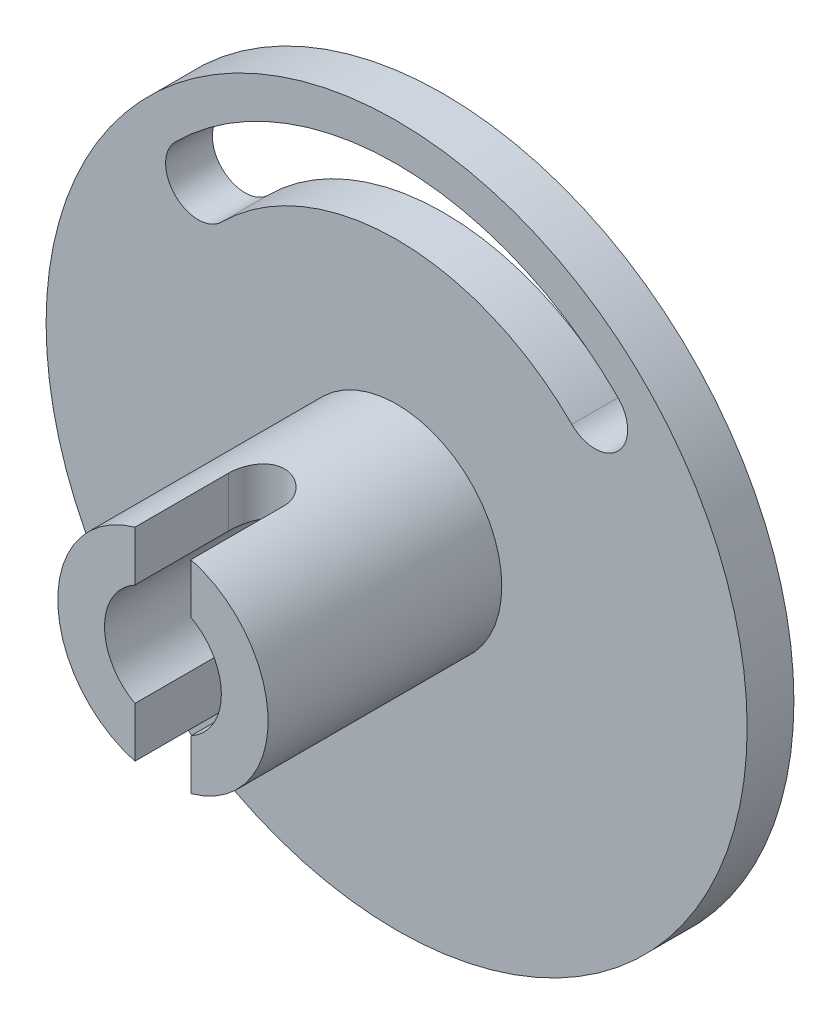
ISO-10303-21;
HEADER;
FILE_DESCRIPTION(('STEP AP214'),'2;1');
FILE_NAME('part.step','',(''),(''),'','','');
FILE_SCHEMA(('AUTOMOTIVE_DESIGN { 1 0 10303 214 1 1 1 1 }'));
ENDSEC;
DATA;
#1=APPLICATION_CONTEXT('core data for automotive mechanical design processes');
#2=APPLICATION_PROTOCOL_DEFINITION('international standard','automotive_design',2000,#1);
#3=PRODUCT_CONTEXT('',#1,'mechanical');
#4=PRODUCT('Part','Part','',(#3));
#5=PRODUCT_RELATED_PRODUCT_CATEGORY('part','',(#4));
#6=PRODUCT_DEFINITION_FORMATION('','',#4);
#7=PRODUCT_DEFINITION_CONTEXT('part definition',#1,'design');
#8=PRODUCT_DEFINITION('design','',#6,#7);
#9=PRODUCT_DEFINITION_SHAPE('','',#8);
#10=(LENGTH_UNIT() NAMED_UNIT(*) SI_UNIT(.MILLI.,.METRE.));
#11=(NAMED_UNIT(*) PLANE_ANGLE_UNIT() SI_UNIT($,.RADIAN.));
#12=(NAMED_UNIT(*) SI_UNIT($,.STERADIAN.) SOLID_ANGLE_UNIT());
#13=UNCERTAINTY_MEASURE_WITH_UNIT(LENGTH_MEASURE(1.E-05),#10,'distance_accuracy_value','');
#14=(GEOMETRIC_REPRESENTATION_CONTEXT(3) GLOBAL_UNCERTAINTY_ASSIGNED_CONTEXT((#13)) GLOBAL_UNIT_ASSIGNED_CONTEXT((#10,
#11,#12)) REPRESENTATION_CONTEXT('',''));
#15=CARTESIAN_POINT('',(0.,0.,0.));
#16=DIRECTION('',(0.,0.,1.));
#17=DIRECTION('',(1.,0.,0.));
#18=AXIS2_PLACEMENT_3D('',#15,#16,#17);
#19=CARTESIAN_POINT('',(0.,-30.,40.));
#20=DIRECTION('',(0.,1.,0.));
#21=DIRECTION('',(0.,0.,1.));
#22=AXIS2_PLACEMENT_3D('',#19,#20,#21);
#23=CYLINDRICAL_SURFACE('',#22,6.);
#24=DIRECTION('',(0.,1.,0.));
#25=VECTOR('',#24,1.);
#26=CARTESIAN_POINT('',(-6.,-30.,40.));
#27=LINE('',#26,#25);
#28=CARTESIAN_POINT('',(-6.,10.9658560997307,40.));
#29=VERTEX_POINT('',#28);
#30=CARTESIAN_POINT('',(-6.,21.6852484422014,40.));
#31=VERTEX_POINT('',#30);
#32=EDGE_CURVE('E228',#29,#31,#27,.T.);
#33=ORIENTED_EDGE('',*,*,#32,.F.);
#34=CARTESIAN_POINT('',(-6.,10.9658560997307,40.));
#35=CARTESIAN_POINT('',(-6.00002865948876,10.9658119468546,39.8419259882187));
#36=CARTESIAN_POINT('',(-5.99375451599358,10.9692726606811,39.6838722207561));
#37=CARTESIAN_POINT('',(-5.96881948529983,10.9828758236465,39.3691201890522));
#38=CARTESIAN_POINT('',(-5.95016553132486,10.9930145327984,39.2124212158005));
#39=CARTESIAN_POINT('',(-5.90082132025953,11.0195753009746,38.9023437710375));
#40=CARTESIAN_POINT('',(-5.8701958306938,11.0359635377871,38.7489520415639));
#41=CARTESIAN_POINT('',(-5.79727964022485,11.0744416185969,38.4456930546913));
#42=CARTESIAN_POINT('',(-5.75498774819269,11.0965320447675,38.295826158871));
#43=CARTESIAN_POINT('',(-5.65928588338994,11.1456431526631,38.0008837379133));
#44=CARTESIAN_POINT('',(-5.60589997779659,11.1726531465412,37.8557986159036));
#45=CARTESIAN_POINT('',(-5.48844655650736,11.2308170083332,37.570857421723));
#46=CARTESIAN_POINT('',(-5.42437498297044,11.2619724495526,37.4310033608222));
#47=CARTESIAN_POINT('',(-5.2167306896531,11.3604221644973,37.0200913822479));
#48=CARTESIAN_POINT('',(-5.05777011280692,11.4326773866541,36.7578109858411));
#49=CARTESIAN_POINT('',(-4.68966781990349,11.5887834599461,36.2430458659001));
#50=CARTESIAN_POINT('',(-4.47765588198518,11.6730975702765,35.9927726188625));
#51=CARTESIAN_POINT('',(-4.01522374861989,11.8401113873892,35.5295510788278));
#52=CARTESIAN_POINT('',(-3.76479376078549,11.9228106764937,35.3166123317687));
#53=CARTESIAN_POINT('',(-3.35614083480019,12.0419362088833,35.0233721116099));
#54=CARTESIAN_POINT('',(-3.20973726709479,12.0818783561493,34.9276924078461));
#55=CARTESIAN_POINT('',(-2.90840720483191,12.1579299817597,34.7491148567846));
#56=CARTESIAN_POINT('',(-2.7534840912193,12.1940409640564,34.6662119880169));
#57=CARTESIAN_POINT('',(-2.43612856249135,12.2613862568142,34.5139950145194));
#58=CARTESIAN_POINT('',(-2.27369783359533,12.2926216555049,34.4446778765709));
#59=CARTESIAN_POINT('',(-1.94246125709468,12.3492939056924,34.32037652835));
#60=CARTESIAN_POINT('',(-1.77365602769167,12.3747313178053,34.2653909322651));
#61=CARTESIAN_POINT('',(-1.44241298474883,12.4175463274212,34.1735953170178));
#62=CARTESIAN_POINT('',(-1.28029686698486,12.4353470131061,34.1358207085291));
#63=CARTESIAN_POINT('',(-0.952942552143277,12.4647060329977,34.0738170536926));
#64=CARTESIAN_POINT('',(-0.787704633331249,12.4762649208831,34.0495868058857));
#65=CARTESIAN_POINT('',(-0.455526503518663,12.4928034709928,34.0149879253022));
#66=CARTESIAN_POINT('',(-0.288587045513745,12.4977859261428,34.0046134081542));
#67=CARTESIAN_POINT('',(0.0456365201176001,12.5010335468412,33.9978462171405));
#68=CARTESIAN_POINT('',(0.212920608276957,12.499299081943,34.0014527740601));
#69=CARTESIAN_POINT('',(0.53294781369326,12.4895756225528,34.0217421262803));
#70=CARTESIAN_POINT('',(0.685776369621216,12.4821019192957,34.0373477386514));
#71=CARTESIAN_POINT('',(0.98948020231024,12.4617052363773,34.0801644991114));
#72=CARTESIAN_POINT('',(1.14035484215988,12.4487805237681,34.1073793379583));
#73=CARTESIAN_POINT('',(1.43902115494811,12.4177998497615,34.1731147223819));
#74=CARTESIAN_POINT('',(1.58681389499011,12.3997456971891,34.2116312827215));
#75=CARTESIAN_POINT('',(1.87849130687657,12.3589226810899,34.299606387742));
#76=CARTESIAN_POINT('',(2.02237446054318,12.3361520148184,34.3490691167609));
#77=CARTESIAN_POINT('',(2.3073494901745,12.2860634503394,34.4592600998468));
#78=CARTESIAN_POINT('',(2.44837311723189,12.258685800032,34.5201377765698));
#79=CARTESIAN_POINT('',(2.72474698441202,12.2002354444059,34.6521741768075));
#80=CARTESIAN_POINT('',(2.86009514569277,12.1691614008679,34.7233366257737));
#81=CARTESIAN_POINT('',(3.25656885919491,12.0713983664922,34.9514744426594));
#82=CARTESIAN_POINT('',(3.50829157931999,12.0001377326273,35.1231657443195));
#83=CARTESIAN_POINT('',(4.00278534575974,11.8448666981681,35.5181762319337));
#84=CARTESIAN_POINT('',(4.24277625794339,11.7602860392511,35.7447262232682));
#85=CARTESIAN_POINT('',(4.68293947649583,11.5920500033531,36.2345756503236));
#86=CARTESIAN_POINT('',(4.88308054052515,11.5083954005457,36.4979036470218));
#87=CARTESIAN_POINT('',(5.15450298754663,11.3882251329188,36.9240180679913));
#88=CARTESIAN_POINT('',(5.2420440990787,11.3480829170677,37.0756594241728));
#89=CARTESIAN_POINT('',(5.40388301696457,11.2719134545959,37.3868108132584));
#90=CARTESIAN_POINT('',(5.47818664143396,11.2358844026786,37.5463173497191));
#91=CARTESIAN_POINT('',(5.61270091926787,11.1692983255289,37.8719566427071));
#92=CARTESIAN_POINT('',(5.67293484246026,11.138732284994,38.0380779186946));
#93=CARTESIAN_POINT('',(5.77872158663383,11.084219027667,38.3758985142118));
#94=CARTESIAN_POINT('',(5.82428083282873,11.0602689147891,38.5475953561667));
#95=CARTESIAN_POINT('',(5.90773031960751,11.0159628213759,38.9302687735291));
#96=CARTESIAN_POINT('',(5.94223918656033,10.9972964956355,39.1422046931604));
#97=CARTESIAN_POINT('',(5.97684365134824,10.9785011938486,39.462484771451));
#98=CARTESIAN_POINT('',(5.98551871669007,10.9737700439536,39.5697158332003));
#99=CARTESIAN_POINT('',(5.99709865291582,10.9674441650941,39.7846209630894));
#100=CARTESIAN_POINT('',(6.00000137642852,10.9658506033473,39.8922951811672));
#101=CARTESIAN_POINT('',(6.,10.9658560997307,40.));
#102=B_SPLINE_CURVE_WITH_KNOTS('',3,(#34,#35,#36,#37,#38,#39,#40,#41,#42,#43,#44,#45,#46,#47,
#48,#49,#50,#51,#52,#53,#54,#55,#56,#57,#58,#59,#60,#61,#62,#63,#64,#65,#66,#67,#68,#69,#70,#71,
#72,#73,#74,#75,#76,#77,#78,#79,#80,#81,#82,#83,#84,#85,#86,#87,#88,#89,#90,#91,#92,#93,#94,#95,
#96,#97,#98,#99,#100,#101),.UNSPECIFIED.,.F.,.F.,(4,2,2,2,2,2,2,2,2,2,2,2,2,2,2,2,2,2,2,2,2,2,2,
2,2,2,2,2,2,2,2,2,2,4),(0.,0.474027754495683,0.947790256942229,1.41902434917404,
1.89030657179063,2.36057688020513,2.8310261802844,3.77232778554665,4.7842552393999,
5.7964410535986,6.33405613251356,6.87145937959838,7.40874250630249,7.94597366022063,
8.44752474430664,8.94903133099696,9.45032486574069,9.95159082057141,10.4124617634167,
10.8734793337998,11.3343345341506,11.7953662085948,12.2629176975072,12.7306389739876,
13.6655389236668,14.6834628863175,15.7021817873902,16.2405100712385,16.7786011631659,
17.3157959052474,17.8527551192991,18.4976279333002,18.8205113672206,19.143514894684),.UNSPECIFIED.);
#103=CARTESIAN_POINT('',(6.,10.9658560997307,40.));
#104=VERTEX_POINT('',#103);
#105=EDGE_CURVE('E48',#29,#104,#102,.T.);
#106=ORIENTED_EDGE('',*,*,#105,.T.);
#107=DIRECTION('',(0.,1.,0.));
#108=VECTOR('',#107,1.);
#109=CARTESIAN_POINT('',(6.,-30.,40.));
#110=LINE('',#109,#108);
#111=CARTESIAN_POINT('',(6.,21.6852484422014,40.));
#112=VERTEX_POINT('',#111);
#113=EDGE_CURVE('E138',#104,#112,#110,.T.);
#114=ORIENTED_EDGE('',*,*,#113,.T.);
#115=CARTESIAN_POINT('',(-6.,21.6852484422014,40.));
#116=CARTESIAN_POINT('',(-6.00002143757072,21.6852278454503,39.8344657481758));
#117=CARTESIAN_POINT('',(-5.99315056555718,21.6871431547269,39.6689387735071));
#118=CARTESIAN_POINT('',(-5.96578222072956,21.6946955183995,39.3391304628435));
#119=CARTESIAN_POINT('',(-5.94528727869301,21.7003318815793,39.1748489012347));
#120=CARTESIAN_POINT('',(-5.89088722832448,21.7151604368289,38.8490506251658));
#121=CARTESIAN_POINT('',(-5.85701103724506,21.7243449602904,38.6875287271007));
#122=CARTESIAN_POINT('',(-5.77614189060431,21.7459869107053,38.3680268504027));
#123=CARTESIAN_POINT('',(-5.7291487046661,21.7584443951422,38.210046934031));
#124=CARTESIAN_POINT('',(-5.62244844449365,21.7862595557273,37.898778157833));
#125=CARTESIAN_POINT('',(-5.5627464521228,21.8016160723642,37.7454874508741));
#126=CARTESIAN_POINT('',(-5.43105556556831,21.8347943803513,37.4444899712217));
#127=CARTESIAN_POINT('',(-5.35906211000339,21.8526170864411,37.2967852964599));
#128=CARTESIAN_POINT('',(-5.20333662362518,21.8902192755553,37.0079769568008));
#129=CARTESIAN_POINT('',(-5.11960543026253,21.9099986189501,36.866872821933));
#130=CARTESIAN_POINT('',(-4.94094856899288,21.9509778091758,36.5920834362246));
#131=CARTESIAN_POINT('',(-4.84601867880679,21.9721781904758,36.4584010117305));
#132=CARTESIAN_POINT('',(-4.64340207624226,22.0158985883613,36.1964708900077));
#133=CARTESIAN_POINT('',(-4.53547997934762,22.0384374065116,36.0684083582649));
#134=CARTESIAN_POINT('',(-4.30929768656988,22.0837781774897,35.821726781896));
#135=CARTESIAN_POINT('',(-4.19103366661629,22.1065802249221,35.7031112616758));
#136=CARTESIAN_POINT('',(-3.94499167074771,22.151809846686,35.4761692828282));
#137=CARTESIAN_POINT('',(-3.81721561547063,22.1742374955011,35.3678407570841));
#138=CARTESIAN_POINT('',(-3.55289974711594,22.218119949707,35.1621328677686));
#139=CARTESIAN_POINT('',(-3.41635672280239,22.2395743936573,35.0647575525824));
#140=CARTESIAN_POINT('',(-3.13322318752662,22.2812410504669,34.8802431997376));
#141=CARTESIAN_POINT('',(-2.9865086519568,22.3014284934186,34.793288724999));
#142=CARTESIAN_POINT('',(-2.68592829952507,22.3396227826506,34.6320500967334));
#143=CARTESIAN_POINT('',(-2.5320597988738,22.3576288012916,34.5577707478492));
#144=CARTESIAN_POINT('',(-2.21838371765237,22.3909274486183,34.4225520151942));
#145=CARTESIAN_POINT('',(-2.05857945457784,22.4062215661867,34.3616053072395));
#146=CARTESIAN_POINT('',(-1.73404500550142,22.4336713831201,34.2534924223287));
#147=CARTESIAN_POINT('',(-1.5693130878467,22.4458259643973,34.2063311540168));
#148=CARTESIAN_POINT('',(-1.24005619019484,22.4663935206214,34.1271586625682));
#149=CARTESIAN_POINT('',(-1.07561422327453,22.4748863939196,34.0948228306116));
#150=CARTESIAN_POINT('',(-0.744456504527512,22.4882912356254,34.0440076424904));
#151=CARTESIAN_POINT('',(-0.577740761466932,22.4932032178345,34.0255282329203));
#152=CARTESIAN_POINT('',(-0.24330107712226,22.4993060509493,34.002592620523));
#153=CARTESIAN_POINT('',(-0.0755772690246393,22.500497383054,33.9981346042814));
#154=CARTESIAN_POINT('',(0.25963824141814,22.4991261882436,34.0032770804847));
#155=CARTESIAN_POINT('',(0.42712994670412,22.4965637093341,34.0128773931451));
#156=CARTESIAN_POINT('',(0.756407114123261,22.4878697933301,34.0456294902287));
#157=CARTESIAN_POINT('',(0.918229819656834,22.4818301770551,34.0684327101634));
#158=CARTESIAN_POINT('',(1.23932087464832,22.4664175641162,34.1271200346061));
#159=CARTESIAN_POINT('',(1.39858926236569,22.4570446174291,34.1630039429955));
#160=CARTESIAN_POINT('',(1.7135065587437,22.4352137308963,34.2475672702987));
#161=CARTESIAN_POINT('',(1.86915475031831,22.4227551854552,34.2962492011335));
#162=CARTESIAN_POINT('',(2.17570551000697,22.3950884203608,34.4060029933642));
#163=CARTESIAN_POINT('',(2.32660963476586,22.3798811139353,34.4670707406092));
#164=CARTESIAN_POINT('',(2.62427084456351,22.3469428831416,34.6018366665011));
#165=CARTESIAN_POINT('',(2.77096937273041,22.3291876297757,34.6756581979149));
#166=CARTESIAN_POINT('',(3.05758902729823,22.2917481176719,34.8349229916975));
#167=CARTESIAN_POINT('',(3.19751240266912,22.2720645056915,34.9203623612322));
#168=CARTESIAN_POINT('',(3.46982739642779,22.231267729594,35.1023343954026));
#169=CARTESIAN_POINT('',(3.60221530664343,22.2101538726621,35.1988724522902));
#170=CARTESIAN_POINT('',(3.85852742029929,22.1670623307285,35.4023341163944));
#171=CARTESIAN_POINT('',(3.98245442062933,22.1450849350055,35.5092542630568));
#172=CARTESIAN_POINT('',(4.22483789945815,22.100144944171,35.7362966744966));
#173=CARTESIAN_POINT('',(4.34300571313122,22.0771729277197,35.8567254470798));
#174=CARTESIAN_POINT('',(4.56877156178869,22.0315589266685,36.10709226248));
#175=CARTESIAN_POINT('',(4.67637327905837,22.0089168294511,36.2370269647348));
#176=CARTESIAN_POINT('',(4.88039540260501,21.9645771459455,36.5056889443041));
#177=CARTESIAN_POINT('',(4.97680836164839,21.9428801946784,36.6444219838755));
#178=CARTESIAN_POINT('',(5.15765441490613,21.9010779321969,36.9296411789587));
#179=CARTESIAN_POINT('',(5.24209215086457,21.880972005625,37.0761243000468));
#180=CARTESIAN_POINT('',(5.39896362810512,21.8427964996012,37.3769906870099));
#181=CARTESIAN_POINT('',(5.47130742687725,21.8247424722398,37.5314228612134));
#182=CARTESIAN_POINT('',(5.60264941366641,21.7913953656778,37.8460799890178));
#183=CARTESIAN_POINT('',(5.66165296998811,21.7761011763808,38.0063025822579));
#184=CARTESIAN_POINT('',(5.76579957731218,21.7487575628776,38.3312763181996));
#185=CARTESIAN_POINT('',(5.81095701352758,21.7367047726813,38.4960225658418));
#186=CARTESIAN_POINT('',(5.88707843694107,21.7162118913142,38.8289135827844));
#187=CARTESIAN_POINT('',(5.9180490391929,21.7077701165167,38.997056729909));
#188=CARTESIAN_POINT('',(5.96117055714157,21.6959642342755,39.3043763773761));
#189=CARTESIAN_POINT('',(5.97573473753105,21.691951910821,39.4431945894639));
#190=CARTESIAN_POINT('',(5.99514636408284,21.6865912402654,39.7213381096254));
#191=CARTESIAN_POINT('',(6.00000917841481,21.6852386798178,39.8606622648436));
#192=CARTESIAN_POINT('',(6.,21.6852484422014,40.));
#193=B_SPLINE_CURVE_WITH_KNOTS('',3,(#115,#116,#117,#118,#119,#120,#121,#122,#123,#124,#125,
#126,#127,#128,#129,#130,#131,#132,#133,#134,#135,#136,#137,#138,#139,#140,#141,#142,#143,#144,
#145,#146,#147,#148,#149,#150,#151,#152,#153,#154,#155,#156,#157,#158,#159,#160,#161,#162,#163,
#164,#165,#166,#167,#168,#169,#170,#171,#172,#173,#174,#175,#176,#177,#178,#179,#180,#181,#182,
#183,#184,#185,#186,#187,#188,#189,#190,#191,#192),.UNSPECIFIED.,.F.,.F.,(4,2,2,2,2,2,2,2,2,2,2,
2,2,2,2,2,2,2,2,2,2,2,2,2,2,2,2,2,2,2,2,2,2,2,2,2,2,2,4),(0.,0.496438006317076,
0.992783821152772,1.48806283603287,1.98335055016238,2.47844058465413,2.9737147487854,
3.46895359463208,3.96437976229343,4.47074463372756,4.97729753881907,5.48374843845111,
5.99038591512974,6.5049719334835,7.0197525799721,7.53424972154362,8.04892983990636,
8.55172844556787,9.05452511333002,9.55725675073325,10.0599819590255,10.5500037204309,
11.0400181352513,11.5301287991346,12.0200769306063,12.5150602417612,13.0098781037772,
13.5049373951488,13.9998322363147,14.5100682457398,15.0201258020639,15.5305209286515,
16.0407176759102,16.5545545005479,17.0681841803881,17.5812784101975,18.0941331496774,
18.5126928408668,18.9305889533136),.UNSPECIFIED.);
#194=EDGE_CURVE('E161',#31,#112,#193,.T.);
#195=ORIENTED_EDGE('',*,*,#194,.F.);
#196=EDGE_LOOP('',(#33,#106,#114,#195));
#197=FACE_BOUND('',#196,.T.);
#198=ADVANCED_FACE('F33',(#197),#23,.F.);
#199=CARTESIAN_POINT('',(6.,-30.,40.));
#200=DIRECTION('',(1.,0.,0.));
#201=DIRECTION('',(0.,0.,-1.));
#202=AXIS2_PLACEMENT_3D('',#199,#200,#201);
#203=PLANE('',#202);
#204=ORIENTED_EDGE('',*,*,#113,.F.);
#205=DIRECTION('',(0.,0.,1.));
#206=VECTOR('',#205,1.);
#207=CARTESIAN_POINT('',(5.99999999999999,10.9658560997307,0.));
#208=LINE('',#207,#206);
#209=CARTESIAN_POINT('',(6.00000000000001,10.9658560997307,60.));
#210=VERTEX_POINT('',#209);
#211=EDGE_CURVE('E123',#104,#210,#208,.T.);
#212=ORIENTED_EDGE('',*,*,#211,.T.);
#213=DIRECTION('',(0.,1.,0.));
#214=VECTOR('',#213,1.);
#215=CARTESIAN_POINT('',(6.00000000000001,-30.,60.));
#216=LINE('',#215,#214);
#217=CARTESIAN_POINT('',(6.00000000000001,21.6852484422014,60.));
#218=VERTEX_POINT('',#217);
#219=EDGE_CURVE('E136',#210,#218,#216,.T.);
#220=ORIENTED_EDGE('',*,*,#219,.T.);
#221=DIRECTION('',(0.,0.,-1.));
#222=VECTOR('',#221,1.);
#223=CARTESIAN_POINT('',(6.00000000000001,21.6852484422014,60.));
#224=LINE('',#223,#222);
#225=EDGE_CURVE('E246',#112,#218,#224,.F.);
#226=ORIENTED_EDGE('',*,*,#225,.F.);
#227=EDGE_LOOP('',(#204,#212,#220,#226));
#228=FACE_BOUND('',#227,.T.);
#229=ADVANCED_FACE('F134',(#228),#203,.F.);
#230=CARTESIAN_POINT('',(-6.,-30.,40.));
#231=DIRECTION('',(-1.,0.,0.));
#232=DIRECTION('',(0.,0.,1.));
#233=AXIS2_PLACEMENT_3D('',#230,#231,#232);
#234=PLANE('',#233);
#235=CARTESIAN_POINT('',(-6.,-21.6852484422014,40.));
#236=VERTEX_POINT('',#235);
#237=CARTESIAN_POINT('',(-6.,-10.9658560997307,40.));
#238=VERTEX_POINT('',#237);
#239=EDGE_CURVE('E238',#236,#238,#27,.T.);
#240=ORIENTED_EDGE('',*,*,#239,.T.);
#241=DIRECTION('',(0.,0.,1.));
#242=VECTOR('',#241,1.);
#243=CARTESIAN_POINT('',(-6.,-10.9658560997307,0.));
#244=LINE('',#243,#242);
#245=CARTESIAN_POINT('',(-6.,-10.9658560997307,60.));
#246=VERTEX_POINT('',#245);
#247=EDGE_CURVE('E11',#238,#246,#244,.T.);
#248=ORIENTED_EDGE('',*,*,#247,.T.);
#249=DIRECTION('',(0.,-1.,0.));
#250=VECTOR('',#249,1.);
#251=CARTESIAN_POINT('',(-6.,0.,60.));
#252=LINE('',#251,#250);
#253=CARTESIAN_POINT('',(-6.,-21.6852484422014,60.));
#254=VERTEX_POINT('',#253);
#255=EDGE_CURVE('E150',#246,#254,#252,.T.);
#256=ORIENTED_EDGE('',*,*,#255,.T.);
#257=DIRECTION('',(0.,0.,-1.));
#258=VECTOR('',#257,1.);
#259=CARTESIAN_POINT('',(-6.,-21.6852484422014,60.));
#260=LINE('',#259,#258);
#261=EDGE_CURVE('E237',#236,#254,#260,.F.);
#262=ORIENTED_EDGE('',*,*,#261,.F.);
#263=EDGE_LOOP('',(#240,#248,#256,#262));
#264=FACE_BOUND('',#263,.T.);
#265=ADVANCED_FACE('F273',(#264),#234,.F.);
#266=CARTESIAN_POINT('',(0.,0.,60.));
#267=DIRECTION('',(0.,0.,1.));
#268=DIRECTION('',(1.,0.,0.));
#269=AXIS2_PLACEMENT_3D('',#266,#267,#268);
#270=PLANE('',#269);
#271=CARTESIAN_POINT('',(0.,0.,60.));
#272=DIRECTION('',(0.,0.,1.));
#273=DIRECTION('',(1.,0.,0.));
#274=AXIS2_PLACEMENT_3D('',#271,#272,#273);
#275=CIRCLE('',#274,12.5);
#276=CARTESIAN_POINT('',(6.00000000000001,-10.9658560997307,60.));
#277=VERTEX_POINT('',#276);
#278=EDGE_CURVE('E120',#277,#210,#275,.T.);
#279=ORIENTED_EDGE('',*,*,#278,.F.);
#280=CARTESIAN_POINT('',(6.00000000000001,-21.6852484422014,60.));
#281=VERTEX_POINT('',#280);
#282=EDGE_CURVE('E145',#281,#277,#216,.T.);
#283=ORIENTED_EDGE('',*,*,#282,.F.);
#284=CARTESIAN_POINT('',(0.,0.,60.));
#285=DIRECTION('',(0.,0.,1.));
#286=DIRECTION('',(1.,0.,0.));
#287=AXIS2_PLACEMENT_3D('',#284,#285,#286);
#288=CIRCLE('',#287,22.5);
#289=EDGE_CURVE('E144',#281,#218,#288,.T.);
#290=ORIENTED_EDGE('',*,*,#289,.T.);
#291=ORIENTED_EDGE('',*,*,#219,.F.);
#292=EDGE_LOOP('',(#279,#283,#290,#291));
#293=FACE_BOUND('',#292,.T.);
#294=ADVANCED_FACE('F142',(#293),#270,.T.);
#295=CARTESIAN_POINT('',(0.,0.,10.));
#296=DIRECTION('',(0.,0.,-1.));
#297=DIRECTION('',(-1.,0.,0.));
#298=AXIS2_PLACEMENT_3D('',#295,#296,#297);
#299=CYLINDRICAL_SURFACE('',#298,75.);
#300=CARTESIAN_POINT('',(0.,0.,10.));
#301=DIRECTION('',(0.,0.,1.));
#302=DIRECTION('',(1.,0.,0.));
#303=AXIS2_PLACEMENT_3D('',#300,#301,#302);
#304=CIRCLE('',#303,75.);
#305=CARTESIAN_POINT('',(75.,0.,10.));
#306=VERTEX_POINT('',#305);
#307=EDGE_CURVE('E256',#306,#306,#304,.T.);
#308=ORIENTED_EDGE('',*,*,#307,.F.);
#309=EDGE_LOOP('',(#308));
#310=FACE_BOUND('',#309,.T.);
#311=CARTESIAN_POINT('',(0.,0.,0.));
#312=DIRECTION('',(0.,0.,1.));
#313=DIRECTION('',(1.,0.,0.));
#314=AXIS2_PLACEMENT_3D('',#311,#312,#313);
#315=CIRCLE('',#314,75.);
#316=CARTESIAN_POINT('',(75.,0.,0.));
#317=VERTEX_POINT('',#316);
#318=EDGE_CURVE('E258',#317,#317,#315,.T.);
#319=ORIENTED_EDGE('',*,*,#318,.T.);
#320=EDGE_LOOP('',(#319));
#321=FACE_BOUND('',#320,.T.);
#322=ADVANCED_FACE('F35',(#310,#321),#299,.T.);
#323=CARTESIAN_POINT('',(0.,0.,10.));
#324=DIRECTION('',(0.,0.,1.));
#325=DIRECTION('',(1.,0.,0.));
#326=AXIS2_PLACEMENT_3D('',#323,#324,#325);
#327=PLANE('',#326);
#328=CARTESIAN_POINT('',(42.4264068711929,42.4264068711928,10.));
#329=DIRECTION('',(0.,0.,1.));
#330=DIRECTION('',(1.,0.,0.));
#331=AXIS2_PLACEMENT_3D('',#328,#329,#330);
#332=CIRCLE('',#331,7.);
#333=CARTESIAN_POINT('',(37.4766594028871,37.4766594028869,10.));
#334=VERTEX_POINT('',#333);
#335=CARTESIAN_POINT('',(47.3761543394988,47.3761543394986,10.));
#336=VERTEX_POINT('',#335);
#337=EDGE_CURVE('E56',#334,#336,#332,.T.);
#338=ORIENTED_EDGE('',*,*,#337,.F.);
#339=CARTESIAN_POINT('',(0.,0.,10.));
#340=DIRECTION('',(0.,0.,-1.));
#341=DIRECTION('',(1.,0.,0.));
#342=AXIS2_PLACEMENT_3D('',#339,#340,#341);
#343=CIRCLE('',#342,53.);
#344=CARTESIAN_POINT('',(-37.4766594028871,37.4766594028869,10.));
#345=VERTEX_POINT('',#344);
#346=EDGE_CURVE('E207',#345,#334,#343,.T.);
#347=ORIENTED_EDGE('',*,*,#346,.F.);
#348=CARTESIAN_POINT('',(-42.4264068711929,42.4264068711928,10.));
#349=DIRECTION('',(0.,0.,1.));
#350=DIRECTION('',(-1.,0.,0.));
#351=AXIS2_PLACEMENT_3D('',#348,#349,#350);
#352=CIRCLE('',#351,7.);
#353=CARTESIAN_POINT('',(-47.3761543394988,47.3761543394986,10.));
#354=VERTEX_POINT('',#353);
#355=EDGE_CURVE('E221',#354,#345,#352,.T.);
#356=ORIENTED_EDGE('',*,*,#355,.F.);
#357=CARTESIAN_POINT('',(0.,0.,10.));
#358=DIRECTION('',(0.,0.,1.));
#359=DIRECTION('',(1.,0.,0.));
#360=AXIS2_PLACEMENT_3D('',#357,#358,#359);
#361=CIRCLE('',#360,67.);
#362=EDGE_CURVE('E218',#336,#354,#361,.T.);
#363=ORIENTED_EDGE('',*,*,#362,.F.);
#364=EDGE_LOOP('',(#338,#347,#356,#363));
#365=FACE_BOUND('',#364,.T.);
#366=CARTESIAN_POINT('',(0.,0.,10.));
#367=DIRECTION('',(0.,0.,1.));
#368=DIRECTION('',(1.,0.,0.));
#369=AXIS2_PLACEMENT_3D('',#366,#367,#368);
#370=CIRCLE('',#369,22.5);
#371=CARTESIAN_POINT('',(22.5,0.,10.));
#372=VERTEX_POINT('',#371);
#373=EDGE_CURVE('E251',#372,#372,#370,.T.);
#374=ORIENTED_EDGE('',*,*,#373,.F.);
#375=EDGE_LOOP('',(#374));
#376=FACE_BOUND('',#375,.T.);
#377=ORIENTED_EDGE('',*,*,#307,.T.);
#378=EDGE_LOOP('',(#377));
#379=FACE_BOUND('',#378,.T.);
#380=ADVANCED_FACE('F314',(#365,#376,#379),#327,.T.);
#381=CARTESIAN_POINT('',(0.,0.,0.));
#382=DIRECTION('',(0.,0.,1.));
#383=DIRECTION('',(1.,0.,0.));
#384=AXIS2_PLACEMENT_3D('',#381,#382,#383);
#385=PLANE('',#384);
#386=CARTESIAN_POINT('',(0.,0.,0.));
#387=DIRECTION('',(0.,0.,1.));
#388=DIRECTION('',(1.,0.,0.));
#389=AXIS2_PLACEMENT_3D('',#386,#387,#388);
#390=CIRCLE('',#389,12.5);
#391=CARTESIAN_POINT('',(12.5,0.,0.));
#392=VERTEX_POINT('',#391);
#393=EDGE_CURVE('E187',#392,#392,#390,.T.);
#394=ORIENTED_EDGE('',*,*,#393,.T.);
#395=EDGE_LOOP('',(#394));
#396=FACE_BOUND('',#395,.T.);
#397=CARTESIAN_POINT('',(0.,0.,0.));
#398=DIRECTION('',(0.,0.,-1.));
#399=DIRECTION('',(1.,0.,0.));
#400=AXIS2_PLACEMENT_3D('',#397,#398,#399);
#401=CIRCLE('',#400,53.);
#402=CARTESIAN_POINT('',(-37.4766594028871,37.4766594028869,0.));
#403=VERTEX_POINT('',#402);
#404=CARTESIAN_POINT('',(37.4766594028871,37.4766594028869,0.));
#405=VERTEX_POINT('',#404);
#406=EDGE_CURVE('E213',#403,#405,#401,.T.);
#407=ORIENTED_EDGE('',*,*,#406,.T.);
#408=CARTESIAN_POINT('',(42.4264068711929,42.4264068711928,0.));
#409=DIRECTION('',(0.,0.,1.));
#410=DIRECTION('',(1.,0.,0.));
#411=AXIS2_PLACEMENT_3D('',#408,#409,#410);
#412=CIRCLE('',#411,7.);
#413=CARTESIAN_POINT('',(47.3761543394988,47.3761543394986,0.));
#414=VERTEX_POINT('',#413);
#415=EDGE_CURVE('E203',#405,#414,#412,.T.);
#416=ORIENTED_EDGE('',*,*,#415,.T.);
#417=CARTESIAN_POINT('',(0.,0.,0.));
#418=DIRECTION('',(0.,0.,1.));
#419=DIRECTION('',(1.,0.,0.));
#420=AXIS2_PLACEMENT_3D('',#417,#418,#419);
#421=CIRCLE('',#420,67.);
#422=CARTESIAN_POINT('',(-47.3761543394988,47.3761543394986,0.));
#423=VERTEX_POINT('',#422);
#424=EDGE_CURVE('E206',#414,#423,#421,.T.);
#425=ORIENTED_EDGE('',*,*,#424,.T.);
#426=CARTESIAN_POINT('',(-42.4264068711929,42.4264068711928,0.));
#427=DIRECTION('',(0.,0.,1.));
#428=DIRECTION('',(-1.,0.,0.));
#429=AXIS2_PLACEMENT_3D('',#426,#427,#428);
#430=CIRCLE('',#429,7.);
#431=EDGE_CURVE('E210',#423,#403,#430,.T.);
#432=ORIENTED_EDGE('',*,*,#431,.T.);
#433=EDGE_LOOP('',(#407,#416,#425,#432));
#434=FACE_BOUND('',#433,.T.);
#435=ORIENTED_EDGE('',*,*,#318,.F.);
#436=EDGE_LOOP('',(#435));
#437=FACE_BOUND('',#436,.T.);
#438=ADVANCED_FACE('F318',(#396,#434,#437),#385,.F.);
#439=CARTESIAN_POINT('',(0.,0.,60.));
#440=DIRECTION('',(0.,0.,-1.));
#441=DIRECTION('',(-1.,0.,0.));
#442=AXIS2_PLACEMENT_3D('',#439,#440,#441);
#443=CYLINDRICAL_SURFACE('',#442,22.5);
#444=ORIENTED_EDGE('',*,*,#194,.T.);
#445=ORIENTED_EDGE('',*,*,#225,.T.);
#446=ORIENTED_EDGE('',*,*,#289,.F.);
#447=DIRECTION('',(0.,0.,-1.));
#448=VECTOR('',#447,1.);
#449=CARTESIAN_POINT('',(6.00000000000001,-21.6852484422014,60.));
#450=LINE('',#449,#448);
#451=CARTESIAN_POINT('',(6.,-21.6852484422014,40.));
#452=VERTEX_POINT('',#451);
#453=EDGE_CURVE('E248',#281,#452,#450,.T.);
#454=ORIENTED_EDGE('',*,*,#453,.T.);
#455=CARTESIAN_POINT('',(6.,-21.6852484422014,40.));
#456=CARTESIAN_POINT('',(6.00002143757073,-21.6852278454503,39.8344657481758));
#457=CARTESIAN_POINT('',(5.99315056555718,-21.6871431547269,39.6689387735071));
#458=CARTESIAN_POINT('',(5.96578222072957,-21.6946955183995,39.3391304628435));
#459=CARTESIAN_POINT('',(5.94528727869301,-21.7003318815793,39.1748489012347));
#460=CARTESIAN_POINT('',(5.89088722832449,-21.7151604368289,38.8490506251658));
#461=CARTESIAN_POINT('',(5.85701103724507,-21.7243449602904,38.6875287271007));
#462=CARTESIAN_POINT('',(5.77614189060431,-21.7459869107053,38.3680268504027));
#463=CARTESIAN_POINT('',(5.72914870466611,-21.7584443951422,38.210046934031));
#464=CARTESIAN_POINT('',(5.62244844449366,-21.7862595557273,37.898778157833));
#465=CARTESIAN_POINT('',(5.56274645212281,-21.8016160723642,37.7454874508741));
#466=CARTESIAN_POINT('',(5.43105556556831,-21.8347943803513,37.4444899712217));
#467=CARTESIAN_POINT('',(5.35906211000339,-21.8526170864411,37.2967852964599));
#468=CARTESIAN_POINT('',(5.20333662362519,-21.8902192755553,37.0079769568008));
#469=CARTESIAN_POINT('',(5.11960543026253,-21.9099986189501,36.866872821933));
#470=CARTESIAN_POINT('',(4.94094856899288,-21.9509778091758,36.5920834362246));
#471=CARTESIAN_POINT('',(4.84601867880679,-21.9721781904758,36.4584010117305));
#472=CARTESIAN_POINT('',(4.64340207624226,-22.0158985883614,36.1964708900077));
#473=CARTESIAN_POINT('',(4.53547997934763,-22.0384374065116,36.0684083582649));
#474=CARTESIAN_POINT('',(4.30929768656989,-22.0837781774897,35.821726781896));
#475=CARTESIAN_POINT('',(4.1910336666163,-22.1065802249221,35.7031112616758));
#476=CARTESIAN_POINT('',(3.94499167074772,-22.151809846686,35.4761692828282));
#477=CARTESIAN_POINT('',(3.81721561547063,-22.1742374955011,35.3678407570841));
#478=CARTESIAN_POINT('',(3.55289974711595,-22.218119949707,35.1621328677686));
#479=CARTESIAN_POINT('',(3.4163567228024,-22.2395743936573,35.0647575525824));
#480=CARTESIAN_POINT('',(3.13322318752662,-22.2812410504669,34.8802431997376));
#481=CARTESIAN_POINT('',(2.98650865195681,-22.3014284934186,34.793288724999));
#482=CARTESIAN_POINT('',(2.68592829952507,-22.3396227826505,34.6320500967334));
#483=CARTESIAN_POINT('',(2.53205979887381,-22.3576288012916,34.5577707478492));
#484=CARTESIAN_POINT('',(2.21838371765238,-22.3909274486183,34.4225520151942));
#485=CARTESIAN_POINT('',(2.05857945457785,-22.4062215661867,34.3616053072395));
#486=CARTESIAN_POINT('',(1.73404500550143,-22.4336713831201,34.2534924223287));
#487=CARTESIAN_POINT('',(1.56931308784671,-22.4458259643973,34.2063311540168));
#488=CARTESIAN_POINT('',(1.24005619019485,-22.4663935206214,34.1271586625682));
#489=CARTESIAN_POINT('',(1.07561422327453,-22.4748863939196,34.0948228306116));
#490=CARTESIAN_POINT('',(0.744456504527518,-22.4882912356254,34.0440076424904));
#491=CARTESIAN_POINT('',(0.577740761466938,-22.4932032178345,34.0255282329203));
#492=CARTESIAN_POINT('',(0.243301077122266,-22.4993060509493,34.002592620523));
#493=CARTESIAN_POINT('',(0.0755772690246451,-22.500497383054,33.9981346042814));
#494=CARTESIAN_POINT('',(-0.259638241418135,-22.4991261882436,34.0032770804847));
#495=CARTESIAN_POINT('',(-0.427129946704114,-22.4965637093341,34.0128773931451));
#496=CARTESIAN_POINT('',(-0.756407114123256,-22.4878697933301,34.0456294902287));
#497=CARTESIAN_POINT('',(-0.91822981965683,-22.4818301770551,34.0684327101634));
#498=CARTESIAN_POINT('',(-1.23932087464831,-22.4664175641162,34.1271200346061));
#499=CARTESIAN_POINT('',(-1.39858926236568,-22.4570446174291,34.1630039429955));
#500=CARTESIAN_POINT('',(-1.71350655874369,-22.4352137308963,34.2475672702987));
#501=CARTESIAN_POINT('',(-1.86915475031831,-22.4227551854552,34.2962492011335));
#502=CARTESIAN_POINT('',(-2.17570551000696,-22.3950884203608,34.4060029933642));
#503=CARTESIAN_POINT('',(-2.32660963476586,-22.3798811139353,34.4670707406092));
#504=CARTESIAN_POINT('',(-2.6242708445635,-22.3469428831416,34.6018366665011));
#505=CARTESIAN_POINT('',(-2.77096937273041,-22.3291876297757,34.6756581979149));
#506=CARTESIAN_POINT('',(-3.05758902729822,-22.2917481176719,34.8349229916975));
#507=CARTESIAN_POINT('',(-3.19751240266911,-22.2720645056915,34.9203623612322));
#508=CARTESIAN_POINT('',(-3.46982739642778,-22.231267729594,35.1023343954026));
#509=CARTESIAN_POINT('',(-3.60221530664343,-22.2101538726621,35.1988724522902));
#510=CARTESIAN_POINT('',(-3.85852742029929,-22.1670623307285,35.4023341163944));
#511=CARTESIAN_POINT('',(-3.98245442062933,-22.1450849350055,35.5092542630568));
#512=CARTESIAN_POINT('',(-4.22483789945815,-22.100144944171,35.7362966744966));
#513=CARTESIAN_POINT('',(-4.34300571313121,-22.0771729277197,35.8567254470798));
#514=CARTESIAN_POINT('',(-4.56877156178869,-22.0315589266685,36.10709226248));
#515=CARTESIAN_POINT('',(-4.67637327905837,-22.0089168294511,36.2370269647348));
#516=CARTESIAN_POINT('',(-4.88039540260501,-21.9645771459455,36.5056889443041));
#517=CARTESIAN_POINT('',(-4.97680836164839,-21.9428801946784,36.6444219838755));
#518=CARTESIAN_POINT('',(-5.15765441490612,-21.9010779321969,36.9296411789587));
#519=CARTESIAN_POINT('',(-5.24209215086456,-21.880972005625,37.0761243000468));
#520=CARTESIAN_POINT('',(-5.39896362810512,-21.8427964996012,37.3769906870099));
#521=CARTESIAN_POINT('',(-5.47130742687724,-21.8247424722398,37.5314228612134));
#522=CARTESIAN_POINT('',(-5.6026494136664,-21.7913953656778,37.8460799890178));
#523=CARTESIAN_POINT('',(-5.66165296998811,-21.7761011763808,38.0063025822579));
#524=CARTESIAN_POINT('',(-5.76579957731217,-21.7487575628776,38.3312763181996));
#525=CARTESIAN_POINT('',(-5.81095701352757,-21.7367047726813,38.4960225658418));
#526=CARTESIAN_POINT('',(-5.88707843694106,-21.7162118913142,38.8289135827844));
#527=CARTESIAN_POINT('',(-5.91804903919289,-21.7077701165167,38.997056729909));
#528=CARTESIAN_POINT('',(-5.96117055714156,-21.6959642342755,39.3043763773761));
#529=CARTESIAN_POINT('',(-5.97573473753104,-21.691951910821,39.4431945894639));
#530=CARTESIAN_POINT('',(-5.99514636408283,-21.6865912402654,39.7213381096254));
#531=CARTESIAN_POINT('',(-6.0000091784148,-21.6852386798178,39.8606622648436));
#532=CARTESIAN_POINT('',(-6.,-21.6852484422014,40.));
#533=B_SPLINE_CURVE_WITH_KNOTS('',3,(#455,#456,#457,#458,#459,#460,#461,#462,#463,#464,#465,
#466,#467,#468,#469,#470,#471,#472,#473,#474,#475,#476,#477,#478,#479,#480,#481,#482,#483,#484,
#485,#486,#487,#488,#489,#490,#491,#492,#493,#494,#495,#496,#497,#498,#499,#500,#501,#502,#503,
#504,#505,#506,#507,#508,#509,#510,#511,#512,#513,#514,#515,#516,#517,#518,#519,#520,#521,#522,
#523,#524,#525,#526,#527,#528,#529,#530,#531,#532),.UNSPECIFIED.,.F.,.F.,(4,2,2,2,2,2,2,2,2,2,2,
2,2,2,2,2,2,2,2,2,2,2,2,2,2,2,2,2,2,2,2,2,2,2,2,2,2,2,4),(0.,0.496438006317076,
0.992783821152772,1.48806283603287,1.98335055016238,2.47844058465413,2.9737147487854,
3.46895359463208,3.96437976229344,4.47074463372756,4.97729753881907,5.48374843845111,
5.99038591512974,6.50497193348349,7.0197525799721,7.53424972154361,8.04892983990636,
8.55172844556787,9.05452511333002,9.55725675073325,10.0599819590255,10.5500037204309,
11.0400181352513,11.5301287991346,12.0200769306063,12.5150602417612,13.0098781037772,
13.5049373951488,13.9998322363147,14.5100682457398,15.0201258020639,15.5305209286515,
16.0407176759102,16.5545545005479,17.0681841803881,17.5812784101975,18.0941331496774,
18.5126928408668,18.9305889533136),.UNSPECIFIED.);
#534=EDGE_CURVE('E148',#452,#236,#533,.T.);
#535=ORIENTED_EDGE('',*,*,#534,.T.);
#536=ORIENTED_EDGE('',*,*,#261,.T.);
#537=CARTESIAN_POINT('',(-6.,21.6852484422014,60.));
#538=VERTEX_POINT('',#537);
#539=EDGE_CURVE('E253',#538,#254,#288,.T.);
#540=ORIENTED_EDGE('',*,*,#539,.F.);
#541=DIRECTION('',(0.,0.,-1.));
#542=VECTOR('',#541,1.);
#543=CARTESIAN_POINT('',(-6.,21.6852484422014,60.));
#544=LINE('',#543,#542);
#545=EDGE_CURVE('E243',#538,#31,#544,.T.);
#546=ORIENTED_EDGE('',*,*,#545,.T.);
#547=EDGE_LOOP('',(#444,#445,#446,#454,#535,#536,#540,#546));
#548=FACE_BOUND('',#547,.T.);
#549=ORIENTED_EDGE('',*,*,#373,.T.);
#550=EDGE_LOOP('',(#549));
#551=FACE_BOUND('',#550,.T.);
#552=ADVANCED_FACE('F165',(#548,#551),#443,.T.);
#553=CARTESIAN_POINT('',(-6.,10.9658560997307,60.));
#554=VERTEX_POINT('',#553);
#555=EDGE_CURVE('E130',#554,#246,#275,.T.);
#556=ORIENTED_EDGE('',*,*,#555,.F.);
#557=EDGE_CURVE('E146',#538,#554,#252,.T.);
#558=ORIENTED_EDGE('',*,*,#557,.F.);
#559=ORIENTED_EDGE('',*,*,#539,.T.);
#560=ORIENTED_EDGE('',*,*,#255,.F.);
#561=EDGE_LOOP('',(#556,#558,#559,#560));
#562=FACE_BOUND('',#561,.T.);
#563=ADVANCED_FACE('F174',(#562),#270,.T.);
#564=CARTESIAN_POINT('',(6.,-10.9658560997307,40.));
#565=VERTEX_POINT('',#564);
#566=EDGE_CURVE('E234',#452,#565,#110,.T.);
#567=ORIENTED_EDGE('',*,*,#566,.T.);
#568=CARTESIAN_POINT('',(6.,-10.9658560997307,40.));
#569=CARTESIAN_POINT('',(6.00002865948877,-10.9658119468546,39.8419259882187));
#570=CARTESIAN_POINT('',(5.99375451599358,-10.9692726606811,39.6838722207561));
#571=CARTESIAN_POINT('',(5.96881948529984,-10.9828758236465,39.3691201890522));
#572=CARTESIAN_POINT('',(5.95016553132486,-10.9930145327984,39.2124212158005));
#573=CARTESIAN_POINT('',(5.90082132025954,-11.0195753009746,38.9023437710375));
#574=CARTESIAN_POINT('',(5.87019583069381,-11.0359635377871,38.7489520415639));
#575=CARTESIAN_POINT('',(5.79727964022485,-11.0744416185969,38.4456930546913));
#576=CARTESIAN_POINT('',(5.7549877481927,-11.0965320447675,38.295826158871));
#577=CARTESIAN_POINT('',(5.65928588338995,-11.1456431526631,38.0008837379133));
#578=CARTESIAN_POINT('',(5.60589997779659,-11.1726531465412,37.8557986159036));
#579=CARTESIAN_POINT('',(5.48844655650736,-11.2308170083332,37.570857421723));
#580=CARTESIAN_POINT('',(5.42437498297044,-11.2619724495526,37.4310033608222));
#581=CARTESIAN_POINT('',(5.2167306896531,-11.3604221644973,37.0200913822479));
#582=CARTESIAN_POINT('',(5.05777011280692,-11.4326773866541,36.7578109858411));
#583=CARTESIAN_POINT('',(4.68966781990349,-11.5887834599461,36.2430458659001));
#584=CARTESIAN_POINT('',(4.47765588198519,-11.6730975702765,35.9927726188625));
#585=CARTESIAN_POINT('',(4.0152237486199,-11.8401113873892,35.5295510788278));
#586=CARTESIAN_POINT('',(3.76479376078549,-11.9228106764937,35.3166123317687));
#587=CARTESIAN_POINT('',(3.35614083480019,-12.0419362088833,35.0233721116099));
#588=CARTESIAN_POINT('',(3.2097372670948,-12.0818783561493,34.9276924078461));
#589=CARTESIAN_POINT('',(2.90840720483191,-12.1579299817597,34.7491148567846));
#590=CARTESIAN_POINT('',(2.7534840912193,-12.1940409640564,34.6662119880169));
#591=CARTESIAN_POINT('',(2.43612856249136,-12.2613862568142,34.5139950145194));
#592=CARTESIAN_POINT('',(2.27369783359533,-12.2926216555049,34.4446778765709));
#593=CARTESIAN_POINT('',(1.94246125709469,-12.3492939056924,34.32037652835));
#594=CARTESIAN_POINT('',(1.77365602769168,-12.3747313178053,34.2653909322651));
#595=CARTESIAN_POINT('',(1.44241298474884,-12.4175463274212,34.1735953170178));
#596=CARTESIAN_POINT('',(1.28029686698486,-12.4353470131061,34.1358207085291));
#597=CARTESIAN_POINT('',(0.952942552143281,-12.4647060329977,34.0738170536926));
#598=CARTESIAN_POINT('',(0.787704633331254,-12.4762649208831,34.0495868058857));
#599=CARTESIAN_POINT('',(0.455526503518668,-12.4928034709928,34.0149879253022));
#600=CARTESIAN_POINT('',(0.28858704551375,-12.4977859261428,34.0046134081542));
#601=CARTESIAN_POINT('',(-0.0456365201175959,-12.5010335468412,33.9978462171405));
#602=CARTESIAN_POINT('',(-0.212920608276953,-12.499299081943,34.0014527740601));
#603=CARTESIAN_POINT('',(-0.532947813693256,-12.4895756225528,34.0217421262803));
#604=CARTESIAN_POINT('',(-0.685776369621211,-12.4821019192957,34.0373477386514));
#605=CARTESIAN_POINT('',(-0.989480202310236,-12.4617052363773,34.0801644991114));
#606=CARTESIAN_POINT('',(-1.14035484215988,-12.4487805237681,34.1073793379583));
#607=CARTESIAN_POINT('',(-1.4390211549481,-12.4177998497615,34.1731147223819));
#608=CARTESIAN_POINT('',(-1.58681389499011,-12.3997456971891,34.2116312827215));
#609=CARTESIAN_POINT('',(-1.87849130687656,-12.3589226810899,34.299606387742));
#610=CARTESIAN_POINT('',(-2.02237446054318,-12.3361520148184,34.3490691167609));
#611=CARTESIAN_POINT('',(-2.30734949017449,-12.2860634503394,34.4592600998468));
#612=CARTESIAN_POINT('',(-2.44837311723189,-12.258685800032,34.5201377765698));
#613=CARTESIAN_POINT('',(-2.72474698441202,-12.2002354444059,34.6521741768075));
#614=CARTESIAN_POINT('',(-2.86009514569277,-12.1691614008679,34.7233366257737));
#615=CARTESIAN_POINT('',(-3.25656885919491,-12.0713983664922,34.9514744426594));
#616=CARTESIAN_POINT('',(-3.50829157931999,-12.0001377326273,35.1231657443195));
#617=CARTESIAN_POINT('',(-4.00278534575974,-11.8448666981681,35.5181762319337));
#618=CARTESIAN_POINT('',(-4.24277625794338,-11.7602860392511,35.7447262232682));
#619=CARTESIAN_POINT('',(-4.68293947649583,-11.5920500033531,36.2345756503236));
#620=CARTESIAN_POINT('',(-4.88308054052514,-11.5083954005457,36.4979036470218));
#621=CARTESIAN_POINT('',(-5.15450298754662,-11.3882251329188,36.9240180679913));
#622=CARTESIAN_POINT('',(-5.24204409907869,-11.3480829170677,37.0756594241728));
#623=CARTESIAN_POINT('',(-5.40388301696456,-11.2719134545959,37.3868108132584));
#624=CARTESIAN_POINT('',(-5.47818664143395,-11.2358844026786,37.5463173497191));
#625=CARTESIAN_POINT('',(-5.61270091926787,-11.1692983255289,37.8719566427071));
#626=CARTESIAN_POINT('',(-5.67293484246025,-11.138732284994,38.0380779186946));
#627=CARTESIAN_POINT('',(-5.77872158663383,-11.084219027667,38.3758985142118));
#628=CARTESIAN_POINT('',(-5.82428083282872,-11.0602689147891,38.5475953561667));
#629=CARTESIAN_POINT('',(-5.90773031960751,-11.0159628213759,38.9302687735291));
#630=CARTESIAN_POINT('',(-5.94223918656032,-10.9972964956355,39.1422046931604));
#631=CARTESIAN_POINT('',(-5.97684365134823,-10.9785011938486,39.462484771451));
#632=CARTESIAN_POINT('',(-5.98551871669006,-10.9737700439536,39.5697158332003));
#633=CARTESIAN_POINT('',(-5.99709865291581,-10.9674441650941,39.7846209630894));
#634=CARTESIAN_POINT('',(-6.00000137642851,-10.9658506033473,39.8922951811672));
#635=CARTESIAN_POINT('',(-6.,-10.9658560997307,40.));
#636=B_SPLINE_CURVE_WITH_KNOTS('',3,(#568,#569,#570,#571,#572,#573,#574,#575,#576,#577,#578,
#579,#580,#581,#582,#583,#584,#585,#586,#587,#588,#589,#590,#591,#592,#593,#594,#595,#596,#597,
#598,#599,#600,#601,#602,#603,#604,#605,#606,#607,#608,#609,#610,#611,#612,#613,#614,#615,#616,
#617,#618,#619,#620,#621,#622,#623,#624,#625,#626,#627,#628,#629,#630,#631,#632,#633,#634,#635),
.UNSPECIFIED.,.F.,.F.,(4,2,2,2,2,2,2,2,2,2,2,2,2,2,2,2,2,2,2,2,2,2,2,2,2,2,2,2,2,2,2,2,2,4),(0.,
0.474027754495683,0.947790256942229,1.41902434917404,1.89030657179063,2.36057688020514,
2.83102618028441,3.77232778554665,4.78425523939991,5.7964410535986,6.33405613251357,
6.87145937959838,7.40874250630249,7.94597366022063,8.44752474430664,8.94903133099696,
9.45032486574069,9.95159082057141,10.4124617634167,10.8734793337998,11.3343345341506,
11.7953662085948,12.2629176975072,12.7306389739876,13.6655389236668,14.6834628863175,
15.7021817873902,16.2405100712385,16.7786011631659,17.3157959052474,17.8527551192991,
18.4976279333002,18.8205113672206,19.143514894684),.UNSPECIFIED.);
#637=EDGE_CURVE('E139',#565,#238,#636,.T.);
#638=ORIENTED_EDGE('',*,*,#637,.T.);
#639=ORIENTED_EDGE('',*,*,#239,.F.);
#640=ORIENTED_EDGE('',*,*,#534,.F.);
#641=EDGE_LOOP('',(#567,#638,#639,#640));
#642=FACE_BOUND('',#641,.T.);
#643=ADVANCED_FACE('F169',(#642),#23,.F.);
#644=ORIENTED_EDGE('',*,*,#282,.T.);
#645=DIRECTION('',(0.,0.,1.));
#646=VECTOR('',#645,1.);
#647=CARTESIAN_POINT('',(5.99999999999999,-10.9658560997307,0.));
#648=LINE('',#647,#646);
#649=EDGE_CURVE('E125',#277,#565,#648,.F.);
#650=ORIENTED_EDGE('',*,*,#649,.T.);
#651=ORIENTED_EDGE('',*,*,#566,.F.);
#652=ORIENTED_EDGE('',*,*,#453,.F.);
#653=EDGE_LOOP('',(#644,#650,#651,#652));
#654=FACE_BOUND('',#653,.T.);
#655=ADVANCED_FACE('F173',(#654),#203,.F.);
#656=ORIENTED_EDGE('',*,*,#557,.T.);
#657=DIRECTION('',(0.,0.,1.));
#658=VECTOR('',#657,1.);
#659=CARTESIAN_POINT('',(-6.,10.9658560997307,0.));
#660=LINE('',#659,#658);
#661=EDGE_CURVE('E41',#554,#29,#660,.F.);
#662=ORIENTED_EDGE('',*,*,#661,.T.);
#663=ORIENTED_EDGE('',*,*,#32,.T.);
#664=ORIENTED_EDGE('',*,*,#545,.F.);
#665=EDGE_LOOP('',(#656,#662,#663,#664));
#666=FACE_BOUND('',#665,.T.);
#667=ADVANCED_FACE('F176',(#666),#234,.F.);
#668=CARTESIAN_POINT('',(42.4264068711929,42.4264068711928,0.));
#669=DIRECTION('',(0.,0.,1.));
#670=DIRECTION('',(1.,0.,0.));
#671=AXIS2_PLACEMENT_3D('',#668,#669,#670);
#672=CYLINDRICAL_SURFACE('',#671,7.);
#673=ORIENTED_EDGE('',*,*,#337,.T.);
#674=DIRECTION('',(0.,0.,1.));
#675=VECTOR('',#674,1.);
#676=CARTESIAN_POINT('',(47.3761543394988,47.3761543394986,0.));
#677=LINE('',#676,#675);
#678=EDGE_CURVE('E216',#414,#336,#677,.T.);
#679=ORIENTED_EDGE('',*,*,#678,.F.);
#680=ORIENTED_EDGE('',*,*,#415,.F.);
#681=DIRECTION('',(0.,0.,1.));
#682=VECTOR('',#681,1.);
#683=CARTESIAN_POINT('',(37.4766594028871,37.4766594028869,0.));
#684=LINE('',#683,#682);
#685=EDGE_CURVE('E226',#405,#334,#684,.T.);
#686=ORIENTED_EDGE('',*,*,#685,.T.);
#687=EDGE_LOOP('',(#673,#679,#680,#686));
#688=FACE_BOUND('',#687,.T.);
#689=ADVANCED_FACE('F292',(#688),#672,.F.);
#690=CARTESIAN_POINT('',(0.,0.,0.));
#691=DIRECTION('',(0.,0.,1.));
#692=DIRECTION('',(1.,0.,0.));
#693=AXIS2_PLACEMENT_3D('',#690,#691,#692);
#694=CYLINDRICAL_SURFACE('',#693,53.);
#695=ORIENTED_EDGE('',*,*,#346,.T.);
#696=ORIENTED_EDGE('',*,*,#685,.F.);
#697=ORIENTED_EDGE('',*,*,#406,.F.);
#698=DIRECTION('',(0.,0.,1.));
#699=VECTOR('',#698,1.);
#700=CARTESIAN_POINT('',(-37.4766594028871,37.4766594028869,0.));
#701=LINE('',#700,#699);
#702=EDGE_CURVE('E229',#403,#345,#701,.T.);
#703=ORIENTED_EDGE('',*,*,#702,.T.);
#704=EDGE_LOOP('',(#695,#696,#697,#703));
#705=FACE_BOUND('',#704,.T.);
#706=ADVANCED_FACE('F194',(#705),#694,.T.);
#707=CARTESIAN_POINT('',(-42.4264068711929,42.4264068711928,0.));
#708=DIRECTION('',(0.,0.,1.));
#709=DIRECTION('',(1.,0.,0.));
#710=AXIS2_PLACEMENT_3D('',#707,#708,#709);
#711=CYLINDRICAL_SURFACE('',#710,7.);
#712=ORIENTED_EDGE('',*,*,#355,.T.);
#713=ORIENTED_EDGE('',*,*,#702,.F.);
#714=ORIENTED_EDGE('',*,*,#431,.F.);
#715=DIRECTION('',(0.,0.,1.));
#716=VECTOR('',#715,1.);
#717=CARTESIAN_POINT('',(-47.3761543394988,47.3761543394986,0.));
#718=LINE('',#717,#716);
#719=EDGE_CURVE('E231',#423,#354,#718,.T.);
#720=ORIENTED_EDGE('',*,*,#719,.T.);
#721=EDGE_LOOP('',(#712,#713,#714,#720));
#722=FACE_BOUND('',#721,.T.);
#723=ADVANCED_FACE('F299',(#722),#711,.F.);
#724=CARTESIAN_POINT('',(0.,0.,0.));
#725=DIRECTION('',(0.,0.,1.));
#726=DIRECTION('',(1.,0.,0.));
#727=AXIS2_PLACEMENT_3D('',#724,#725,#726);
#728=CYLINDRICAL_SURFACE('',#727,67.);
#729=ORIENTED_EDGE('',*,*,#362,.T.);
#730=ORIENTED_EDGE('',*,*,#719,.F.);
#731=ORIENTED_EDGE('',*,*,#424,.F.);
#732=ORIENTED_EDGE('',*,*,#678,.T.);
#733=EDGE_LOOP('',(#729,#730,#731,#732));
#734=FACE_BOUND('',#733,.T.);
#735=ADVANCED_FACE('F192',(#734),#728,.F.);
#736=CARTESIAN_POINT('',(0.,0.,0.));
#737=DIRECTION('',(0.,0.,1.));
#738=DIRECTION('',(1.,0.,0.));
#739=AXIS2_PLACEMENT_3D('',#736,#737,#738);
#740=CYLINDRICAL_SURFACE('',#739,12.5);
#741=ORIENTED_EDGE('',*,*,#393,.F.);
#742=EDGE_LOOP('',(#741));
#743=FACE_BOUND('',#742,.T.);
#744=ORIENTED_EDGE('',*,*,#278,.T.);
#745=ORIENTED_EDGE('',*,*,#211,.F.);
#746=ORIENTED_EDGE('',*,*,#105,.F.);
#747=ORIENTED_EDGE('',*,*,#661,.F.);
#748=ORIENTED_EDGE('',*,*,#555,.T.);
#749=ORIENTED_EDGE('',*,*,#247,.F.);
#750=ORIENTED_EDGE('',*,*,#637,.F.);
#751=ORIENTED_EDGE('',*,*,#649,.F.);
#752=EDGE_LOOP('',(#744,#745,#746,#747,#748,#749,#750,#751));
#753=FACE_BOUND('',#752,.T.);
#754=ADVANCED_FACE('F122',(#743,#753),#740,.F.);
#755=CLOSED_SHELL('',(#198,#229,#265,#294,#322,#380,#438,#552,#563,#643,#655,#667,#689,#706,
#723,#735,#754));
#756=MANIFOLD_SOLID_BREP('B2',#755);
#757=ADVANCED_BREP_SHAPE_REPRESENTATION('',(#18,#756),#14);
#758=SHAPE_DEFINITION_REPRESENTATION(#9,#757);
ENDSEC;
END-ISO-10303-21;
